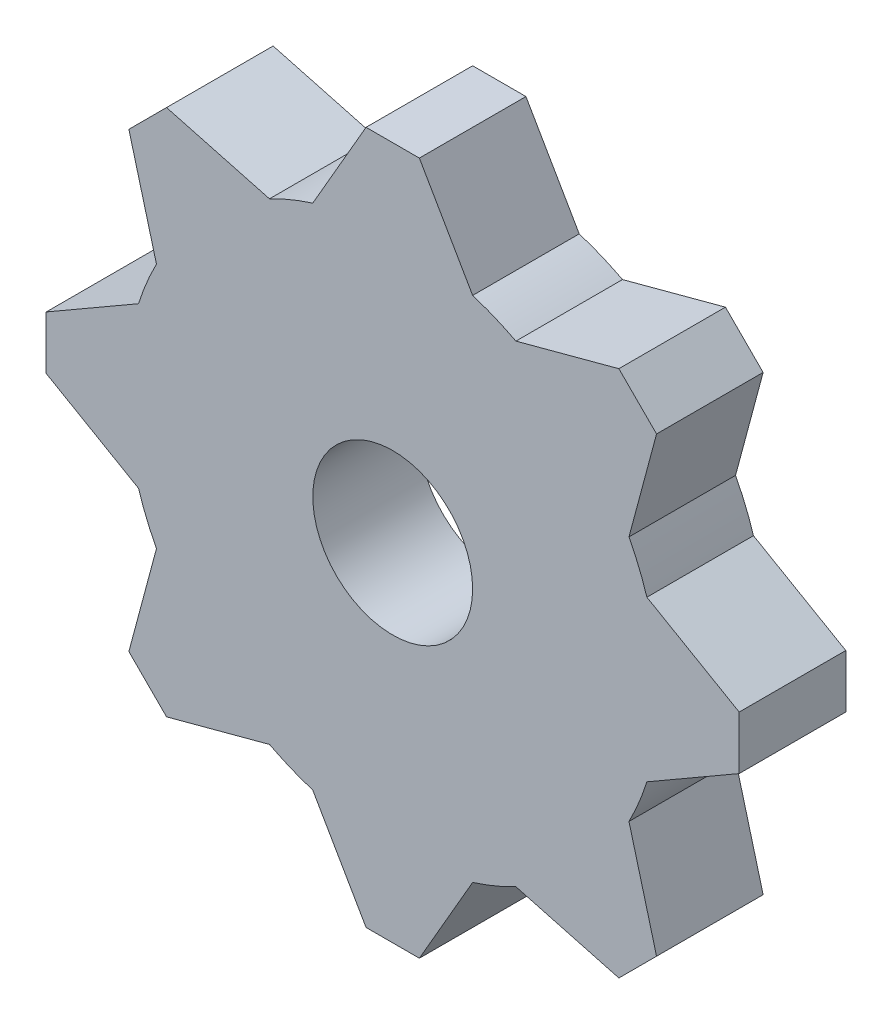
ISO-10303-21;
HEADER;
FILE_DESCRIPTION(('STEP AP214'),'2;1');
FILE_NAME('part.step','',(''),(''),'','','');
FILE_SCHEMA(('AUTOMOTIVE_DESIGN { 1 0 10303 214 1 1 1 1 }'));
ENDSEC;
DATA;
#1=APPLICATION_CONTEXT('core data for automotive mechanical design processes');
#2=APPLICATION_PROTOCOL_DEFINITION('international standard','automotive_design',2000,#1);
#3=PRODUCT_CONTEXT('',#1,'mechanical');
#4=PRODUCT('Part','Part','',(#3));
#5=PRODUCT_RELATED_PRODUCT_CATEGORY('part','',(#4));
#6=PRODUCT_DEFINITION_FORMATION('','',#4);
#7=PRODUCT_DEFINITION_CONTEXT('part definition',#1,'design');
#8=PRODUCT_DEFINITION('design','',#6,#7);
#9=PRODUCT_DEFINITION_SHAPE('','',#8);
#10=(LENGTH_UNIT() NAMED_UNIT(*) SI_UNIT(.MILLI.,.METRE.));
#11=(NAMED_UNIT(*) PLANE_ANGLE_UNIT() SI_UNIT($,.RADIAN.));
#12=(NAMED_UNIT(*) SI_UNIT($,.STERADIAN.) SOLID_ANGLE_UNIT());
#13=UNCERTAINTY_MEASURE_WITH_UNIT(LENGTH_MEASURE(1.E-05),#10,'distance_accuracy_value','');
#14=(GEOMETRIC_REPRESENTATION_CONTEXT(3) GLOBAL_UNCERTAINTY_ASSIGNED_CONTEXT((#13)) GLOBAL_UNIT_ASSIGNED_CONTEXT((#10,
#11,#12)) REPRESENTATION_CONTEXT('',''));
#15=CARTESIAN_POINT('',(0.,0.,0.));
#16=DIRECTION('',(0.,0.,1.));
#17=DIRECTION('',(1.,0.,0.));
#18=AXIS2_PLACEMENT_3D('',#15,#16,#17);
#19=CARTESIAN_POINT('',(0.,0.,20.));
#20=DIRECTION('',(0.,0.,1.));
#21=DIRECTION('',(1.,0.,0.));
#22=AXIS2_PLACEMENT_3D('',#19,#20,#21);
#23=PLANE('',#22);
#24=DIRECTION('',(-0.500000000000001,-0.866025403784438,0.));
#25=VECTOR('',#24,1.);
#26=CARTESIAN_POINT('',(-5.00000000000001,65.0174681465361,20.));
#27=LINE('',#26,#25);
#28=CARTESIAN_POINT('',(-5.00000000000001,65.0174681465361,20.));
#29=VERTEX_POINT('',#28);
#30=CARTESIAN_POINT('',(-15.,47.6969600708473,20.));
#31=VERTEX_POINT('',#30);
#32=EDGE_CURVE('E380',#29,#31,#27,.T.);
#33=ORIENTED_EDGE('',*,*,#32,.T.);
#34=CARTESIAN_POINT('',(0.,0.,20.));
#35=DIRECTION('',(0.,0.,1.));
#36=DIRECTION('',(1.,0.,0.));
#37=AXIS2_PLACEMENT_3D('',#34,#35,#36);
#38=CIRCLE('',#37,50.);
#39=CARTESIAN_POINT('',(-23.1202421902819,44.3334456258783,20.));
#40=VERTEX_POINT('',#39);
#41=EDGE_CURVE('E172',#31,#40,#38,.T.);
#42=ORIENTED_EDGE('',*,*,#41,.T.);
#43=DIRECTION('',(-0.965925826289068,0.25881904510252,0.));
#44=VECTOR('',#43,1.);
#45=CARTESIAN_POINT('',(-42.4387587160633,49.5098265279287,20.));
#46=LINE('',#45,#44);
#47=CARTESIAN_POINT('',(-42.4387587160633,49.5098265279287,20.));
#48=VERTEX_POINT('',#47);
#49=EDGE_CURVE('E497',#40,#48,#46,.T.);
#50=ORIENTED_EDGE('',*,*,#49,.T.);
#51=DIRECTION('',(-0.707106781186547,-0.707106781186548,0.));
#52=VECTOR('',#51,1.);
#53=CARTESIAN_POINT('',(-49.5098265279287,42.4387587160632,20.));
#54=LINE('',#53,#52);
#55=CARTESIAN_POINT('',(-49.5098265279287,42.4387587160632,20.));
#56=VERTEX_POINT('',#55);
#57=EDGE_CURVE('E517',#48,#56,#54,.T.);
#58=ORIENTED_EDGE('',*,*,#57,.T.);
#59=DIRECTION('',(0.25881904510252,-0.965925826289069,0.));
#60=VECTOR('',#59,1.);
#61=CARTESIAN_POINT('',(-49.5098265279287,42.4387587160632,20.));
#62=LINE('',#61,#60);
#63=CARTESIAN_POINT('',(-44.3334456258783,23.1202421902819,20.));
#64=VERTEX_POINT('',#63);
#65=EDGE_CURVE('E513',#56,#64,#62,.T.);
#66=ORIENTED_EDGE('',*,*,#65,.T.);
#67=CARTESIAN_POINT('',(0.,0.,20.));
#68=DIRECTION('',(0.,0.,1.));
#69=DIRECTION('',(1.,0.,0.));
#70=AXIS2_PLACEMENT_3D('',#67,#68,#69);
#71=CIRCLE('',#70,50.);
#72=CARTESIAN_POINT('',(-47.6969600708473,15.,20.));
#73=VERTEX_POINT('',#72);
#74=EDGE_CURVE('E516',#64,#73,#71,.T.);
#75=ORIENTED_EDGE('',*,*,#74,.T.);
#76=DIRECTION('',(-0.866025403784438,-0.500000000000001,0.));
#77=VECTOR('',#76,1.);
#78=CARTESIAN_POINT('',(-65.0174681465361,4.99999999999998,20.));
#79=LINE('',#78,#77);
#80=CARTESIAN_POINT('',(-65.0174681465361,4.99999999999998,20.));
#81=VERTEX_POINT('',#80);
#82=EDGE_CURVE('E521',#73,#81,#79,.T.);
#83=ORIENTED_EDGE('',*,*,#82,.T.);
#84=DIRECTION('',(0.,-1.,0.));
#85=VECTOR('',#84,1.);
#86=CARTESIAN_POINT('',(-65.0174681465361,-5.00000000000002,20.));
#87=LINE('',#86,#85);
#88=CARTESIAN_POINT('',(-65.0174681465361,-5.00000000000002,20.));
#89=VERTEX_POINT('',#88);
#90=EDGE_CURVE('E528',#81,#89,#87,.T.);
#91=ORIENTED_EDGE('',*,*,#90,.T.);
#92=DIRECTION('',(0.866025403784438,-0.500000000000001,0.));
#93=VECTOR('',#92,1.);
#94=CARTESIAN_POINT('',(-65.0174681465361,-5.00000000000002,20.));
#95=LINE('',#94,#93);
#96=CARTESIAN_POINT('',(-47.6969600708473,-15.,20.));
#97=VERTEX_POINT('',#96);
#98=EDGE_CURVE('E531',#89,#97,#95,.T.);
#99=ORIENTED_EDGE('',*,*,#98,.T.);
#100=CARTESIAN_POINT('',(0.,0.,20.));
#101=DIRECTION('',(0.,0.,1.));
#102=DIRECTION('',(1.,0.,0.));
#103=AXIS2_PLACEMENT_3D('',#100,#101,#102);
#104=CIRCLE('',#103,50.);
#105=CARTESIAN_POINT('',(-44.3334456258783,-23.1202421902819,20.));
#106=VERTEX_POINT('',#105);
#107=EDGE_CURVE('E534',#97,#106,#104,.T.);
#108=ORIENTED_EDGE('',*,*,#107,.T.);
#109=DIRECTION('',(-0.25881904510252,-0.965925826289068,0.));
#110=VECTOR('',#109,1.);
#111=CARTESIAN_POINT('',(-49.5098265279287,-42.4387587160633,20.));
#112=LINE('',#111,#110);
#113=CARTESIAN_POINT('',(-49.5098265279287,-42.4387587160633,20.));
#114=VERTEX_POINT('',#113);
#115=EDGE_CURVE('E537',#106,#114,#112,.T.);
#116=ORIENTED_EDGE('',*,*,#115,.T.);
#117=DIRECTION('',(0.707106781186548,-0.707106781186547,0.));
#118=VECTOR('',#117,1.);
#119=CARTESIAN_POINT('',(-42.4387587160632,-49.5098265279287,20.));
#120=LINE('',#119,#118);
#121=CARTESIAN_POINT('',(-42.4387587160632,-49.5098265279287,20.));
#122=VERTEX_POINT('',#121);
#123=EDGE_CURVE('E540',#114,#122,#120,.T.);
#124=ORIENTED_EDGE('',*,*,#123,.T.);
#125=DIRECTION('',(0.965925826289069,0.25881904510252,0.));
#126=VECTOR('',#125,1.);
#127=CARTESIAN_POINT('',(-42.4387587160632,-49.5098265279287,20.));
#128=LINE('',#127,#126);
#129=CARTESIAN_POINT('',(-23.1202421902819,-44.3334456258783,20.));
#130=VERTEX_POINT('',#129);
#131=EDGE_CURVE('E543',#122,#130,#128,.T.);
#132=ORIENTED_EDGE('',*,*,#131,.T.);
#133=CARTESIAN_POINT('',(0.,0.,20.));
#134=DIRECTION('',(0.,0.,1.));
#135=DIRECTION('',(1.,0.,0.));
#136=AXIS2_PLACEMENT_3D('',#133,#134,#135);
#137=CIRCLE('',#136,50.);
#138=CARTESIAN_POINT('',(-15.,-47.6969600708473,20.));
#139=VERTEX_POINT('',#138);
#140=EDGE_CURVE('E546',#130,#139,#137,.T.);
#141=ORIENTED_EDGE('',*,*,#140,.T.);
#142=DIRECTION('',(0.500000000000001,-0.866025403784438,0.));
#143=VECTOR('',#142,1.);
#144=CARTESIAN_POINT('',(-4.99999999999999,-65.0174681465361,20.));
#145=LINE('',#144,#143);
#146=CARTESIAN_POINT('',(-4.99999999999999,-65.0174681465361,20.));
#147=VERTEX_POINT('',#146);
#148=EDGE_CURVE('E549',#139,#147,#145,.T.);
#149=ORIENTED_EDGE('',*,*,#148,.T.);
#150=DIRECTION('',(1.,0.,0.));
#151=VECTOR('',#150,1.);
#152=CARTESIAN_POINT('',(5.00000000000001,-65.0174681465361,20.));
#153=LINE('',#152,#151);
#154=CARTESIAN_POINT('',(5.00000000000001,-65.0174681465361,20.));
#155=VERTEX_POINT('',#154);
#156=EDGE_CURVE('E552',#147,#155,#153,.T.);
#157=ORIENTED_EDGE('',*,*,#156,.T.);
#158=DIRECTION('',(0.500000000000001,0.866025403784438,0.));
#159=VECTOR('',#158,1.);
#160=CARTESIAN_POINT('',(5.00000000000001,-65.0174681465361,20.));
#161=LINE('',#160,#159);
#162=CARTESIAN_POINT('',(15.,-47.6969600708473,20.));
#163=VERTEX_POINT('',#162);
#164=EDGE_CURVE('E555',#155,#163,#161,.T.);
#165=ORIENTED_EDGE('',*,*,#164,.T.);
#166=CARTESIAN_POINT('',(0.,0.,20.));
#167=DIRECTION('',(0.,0.,1.));
#168=DIRECTION('',(1.,0.,0.));
#169=AXIS2_PLACEMENT_3D('',#166,#167,#168);
#170=CIRCLE('',#169,50.);
#171=CARTESIAN_POINT('',(23.1202421902819,-44.3334456258783,20.));
#172=VERTEX_POINT('',#171);
#173=EDGE_CURVE('E558',#163,#172,#170,.T.);
#174=ORIENTED_EDGE('',*,*,#173,.T.);
#175=DIRECTION('',(0.965925826289068,-0.25881904510252,0.));
#176=VECTOR('',#175,1.);
#177=CARTESIAN_POINT('',(42.4387587160633,-49.5098265279287,20.));
#178=LINE('',#177,#176);
#179=CARTESIAN_POINT('',(42.4387587160633,-49.5098265279287,20.));
#180=VERTEX_POINT('',#179);
#181=EDGE_CURVE('E561',#172,#180,#178,.T.);
#182=ORIENTED_EDGE('',*,*,#181,.T.);
#183=DIRECTION('',(0.707106781186547,0.707106781186547,0.));
#184=VECTOR('',#183,1.);
#185=CARTESIAN_POINT('',(49.5098265279287,-42.4387587160632,20.));
#186=LINE('',#185,#184);
#187=CARTESIAN_POINT('',(49.5098265279287,-42.4387587160632,20.));
#188=VERTEX_POINT('',#187);
#189=EDGE_CURVE('E564',#180,#188,#186,.T.);
#190=ORIENTED_EDGE('',*,*,#189,.T.);
#191=DIRECTION('',(-0.258819045102519,0.965925826289069,0.));
#192=VECTOR('',#191,1.);
#193=CARTESIAN_POINT('',(49.5098265279287,-42.4387587160632,20.));
#194=LINE('',#193,#192);
#195=CARTESIAN_POINT('',(44.3334456258783,-23.1202421902819,20.));
#196=VERTEX_POINT('',#195);
#197=EDGE_CURVE('E567',#188,#196,#194,.T.);
#198=ORIENTED_EDGE('',*,*,#197,.T.);
#199=CARTESIAN_POINT('',(0.,0.,20.));
#200=DIRECTION('',(0.,0.,1.));
#201=DIRECTION('',(1.,0.,0.));
#202=AXIS2_PLACEMENT_3D('',#199,#200,#201);
#203=CIRCLE('',#202,50.);
#204=CARTESIAN_POINT('',(47.6969600708473,-15.,20.));
#205=VERTEX_POINT('',#204);
#206=EDGE_CURVE('E570',#196,#205,#203,.T.);
#207=ORIENTED_EDGE('',*,*,#206,.T.);
#208=DIRECTION('',(0.866025403784438,0.500000000000001,0.));
#209=VECTOR('',#208,1.);
#210=CARTESIAN_POINT('',(65.0174681465361,-4.99999999999999,20.));
#211=LINE('',#210,#209);
#212=CARTESIAN_POINT('',(65.0174681465361,-4.99999999999999,20.));
#213=VERTEX_POINT('',#212);
#214=EDGE_CURVE('E573',#205,#213,#211,.T.);
#215=ORIENTED_EDGE('',*,*,#214,.T.);
#216=DIRECTION('',(0.,1.,0.));
#217=VECTOR('',#216,1.);
#218=CARTESIAN_POINT('',(65.0174681465361,5.00000000000001,20.));
#219=LINE('',#218,#217);
#220=CARTESIAN_POINT('',(65.0174681465361,5.00000000000001,20.));
#221=VERTEX_POINT('',#220);
#222=EDGE_CURVE('E576',#213,#221,#219,.T.);
#223=ORIENTED_EDGE('',*,*,#222,.T.);
#224=DIRECTION('',(-0.866025403784438,0.500000000000001,0.));
#225=VECTOR('',#224,1.);
#226=CARTESIAN_POINT('',(65.0174681465361,5.00000000000001,20.));
#227=LINE('',#226,#225);
#228=CARTESIAN_POINT('',(47.6969600708473,15.,20.));
#229=VERTEX_POINT('',#228);
#230=EDGE_CURVE('E579',#221,#229,#227,.T.);
#231=ORIENTED_EDGE('',*,*,#230,.T.);
#232=CARTESIAN_POINT('',(0.,0.,20.));
#233=DIRECTION('',(0.,0.,1.));
#234=DIRECTION('',(1.,0.,0.));
#235=AXIS2_PLACEMENT_3D('',#232,#233,#234);
#236=CIRCLE('',#235,50.);
#237=CARTESIAN_POINT('',(44.3334456258783,23.1202421902819,20.));
#238=VERTEX_POINT('',#237);
#239=EDGE_CURVE('E582',#229,#238,#236,.T.);
#240=ORIENTED_EDGE('',*,*,#239,.T.);
#241=DIRECTION('',(0.25881904510252,0.965925826289068,0.));
#242=VECTOR('',#241,1.);
#243=CARTESIAN_POINT('',(49.5098265279287,42.4387587160633,20.));
#244=LINE('',#243,#242);
#245=CARTESIAN_POINT('',(49.5098265279287,42.4387587160633,20.));
#246=VERTEX_POINT('',#245);
#247=EDGE_CURVE('E585',#238,#246,#244,.T.);
#248=ORIENTED_EDGE('',*,*,#247,.T.);
#249=DIRECTION('',(-0.707106781186547,0.707106781186547,0.));
#250=VECTOR('',#249,1.);
#251=CARTESIAN_POINT('',(42.4387587160633,49.5098265279287,20.));
#252=LINE('',#251,#250);
#253=CARTESIAN_POINT('',(42.4387587160633,49.5098265279287,20.));
#254=VERTEX_POINT('',#253);
#255=EDGE_CURVE('E588',#246,#254,#252,.T.);
#256=ORIENTED_EDGE('',*,*,#255,.T.);
#257=DIRECTION('',(-0.965925826289069,-0.258819045102519,0.));
#258=VECTOR('',#257,1.);
#259=CARTESIAN_POINT('',(42.4387587160633,49.5098265279287,20.));
#260=LINE('',#259,#258);
#261=CARTESIAN_POINT('',(23.1202421902819,44.3334456258783,20.));
#262=VERTEX_POINT('',#261);
#263=EDGE_CURVE('E263',#254,#262,#260,.T.);
#264=ORIENTED_EDGE('',*,*,#263,.T.);
#265=CARTESIAN_POINT('',(0.,0.,20.));
#266=DIRECTION('',(0.,0.,1.));
#267=DIRECTION('',(1.,0.,0.));
#268=AXIS2_PLACEMENT_3D('',#265,#266,#267);
#269=CIRCLE('',#268,50.);
#270=CARTESIAN_POINT('',(15.,47.6969600708473,20.));
#271=VERTEX_POINT('',#270);
#272=EDGE_CURVE('E257',#262,#271,#269,.T.);
#273=ORIENTED_EDGE('',*,*,#272,.T.);
#274=DIRECTION('',(-0.500000000000001,0.866025403784438,0.));
#275=VECTOR('',#274,1.);
#276=CARTESIAN_POINT('',(4.99999999999999,65.0174681465361,20.));
#277=LINE('',#276,#275);
#278=CARTESIAN_POINT('',(4.99999999999999,65.0174681465361,20.));
#279=VERTEX_POINT('',#278);
#280=EDGE_CURVE('E261',#271,#279,#277,.T.);
#281=ORIENTED_EDGE('',*,*,#280,.T.);
#282=DIRECTION('',(-1.,0.,0.));
#283=VECTOR('',#282,1.);
#284=CARTESIAN_POINT('',(-5.00000000000001,65.0174681465361,20.));
#285=LINE('',#284,#283);
#286=EDGE_CURVE('E57',#279,#29,#285,.T.);
#287=ORIENTED_EDGE('',*,*,#286,.T.);
#288=EDGE_LOOP('',(#33,#42,#50,#58,#66,#75,#83,#91,#99,#108,#116,#124,#132,#141,#149,#157,#165,
#174,#182,#190,#198,#207,#215,#223,#231,#240,#248,#256,#264,#273,#281,#287));
#289=FACE_BOUND('',#288,.T.);
#290=CARTESIAN_POINT('',(0.,0.,20.));
#291=DIRECTION('',(0.,0.,1.));
#292=DIRECTION('',(1.,0.,0.));
#293=AXIS2_PLACEMENT_3D('',#290,#291,#292);
#294=CIRCLE('',#293,15.);
#295=CARTESIAN_POINT('',(15.,0.,20.));
#296=VERTEX_POINT('',#295);
#297=EDGE_CURVE('E290',#296,#296,#294,.T.);
#298=ORIENTED_EDGE('',*,*,#297,.F.);
#299=EDGE_LOOP('',(#298));
#300=FACE_BOUND('',#299,.T.);
#301=ADVANCED_FACE('F39',(#289,#300),#23,.T.);
#302=CARTESIAN_POINT('',(0.,0.,0.));
#303=DIRECTION('',(0.,0.,1.));
#304=DIRECTION('',(1.,0.,0.));
#305=AXIS2_PLACEMENT_3D('',#302,#303,#304);
#306=PLANE('',#305);
#307=DIRECTION('',(-0.500000000000001,-0.866025403784438,0.));
#308=VECTOR('',#307,1.);
#309=CARTESIAN_POINT('',(-5.00000000000001,65.0174681465361,0.));
#310=LINE('',#309,#308);
#311=CARTESIAN_POINT('',(-5.00000000000001,65.0174681465361,0.));
#312=VERTEX_POINT('',#311);
#313=CARTESIAN_POINT('',(-15.,47.6969600708473,0.));
#314=VERTEX_POINT('',#313);
#315=EDGE_CURVE('E285',#312,#314,#310,.T.);
#316=ORIENTED_EDGE('',*,*,#315,.F.);
#317=DIRECTION('',(-1.,0.,0.));
#318=VECTOR('',#317,1.);
#319=CARTESIAN_POINT('',(-5.00000000000001,65.0174681465361,0.));
#320=LINE('',#319,#318);
#321=CARTESIAN_POINT('',(4.99999999999999,65.0174681465361,0.));
#322=VERTEX_POINT('',#321);
#323=EDGE_CURVE('E164',#322,#312,#320,.T.);
#324=ORIENTED_EDGE('',*,*,#323,.F.);
#325=DIRECTION('',(-0.500000000000001,0.866025403784438,0.));
#326=VECTOR('',#325,1.);
#327=CARTESIAN_POINT('',(4.99999999999999,65.0174681465361,0.));
#328=LINE('',#327,#326);
#329=CARTESIAN_POINT('',(15.,47.6969600708473,0.));
#330=VERTEX_POINT('',#329);
#331=EDGE_CURVE('E158',#330,#322,#328,.T.);
#332=ORIENTED_EDGE('',*,*,#331,.F.);
#333=CARTESIAN_POINT('',(0.,0.,0.));
#334=DIRECTION('',(0.,0.,1.));
#335=DIRECTION('',(1.,0.,0.));
#336=AXIS2_PLACEMENT_3D('',#333,#334,#335);
#337=CIRCLE('',#336,50.);
#338=CARTESIAN_POINT('',(23.1202421902819,44.3334456258783,0.));
#339=VERTEX_POINT('',#338);
#340=EDGE_CURVE('E272',#339,#330,#337,.T.);
#341=ORIENTED_EDGE('',*,*,#340,.F.);
#342=DIRECTION('',(-0.965925826289069,-0.258819045102519,0.));
#343=VECTOR('',#342,1.);
#344=CARTESIAN_POINT('',(42.4387587160633,49.5098265279287,0.));
#345=LINE('',#344,#343);
#346=CARTESIAN_POINT('',(42.4387587160633,49.5098265279287,0.));
#347=VERTEX_POINT('',#346);
#348=EDGE_CURVE('E371',#347,#339,#345,.T.);
#349=ORIENTED_EDGE('',*,*,#348,.F.);
#350=DIRECTION('',(-0.707106781186547,0.707106781186547,0.));
#351=VECTOR('',#350,1.);
#352=CARTESIAN_POINT('',(42.4387587160633,49.5098265279287,0.));
#353=LINE('',#352,#351);
#354=CARTESIAN_POINT('',(49.5098265279287,42.4387587160633,0.));
#355=VERTEX_POINT('',#354);
#356=EDGE_CURVE('E368',#355,#347,#353,.T.);
#357=ORIENTED_EDGE('',*,*,#356,.F.);
#358=DIRECTION('',(0.25881904510252,0.965925826289068,0.));
#359=VECTOR('',#358,1.);
#360=CARTESIAN_POINT('',(49.5098265279287,42.4387587160633,0.));
#361=LINE('',#360,#359);
#362=CARTESIAN_POINT('',(44.3334456258783,23.1202421902819,0.));
#363=VERTEX_POINT('',#362);
#364=EDGE_CURVE('E365',#363,#355,#361,.T.);
#365=ORIENTED_EDGE('',*,*,#364,.F.);
#366=CARTESIAN_POINT('',(0.,0.,0.));
#367=DIRECTION('',(0.,0.,1.));
#368=DIRECTION('',(1.,0.,0.));
#369=AXIS2_PLACEMENT_3D('',#366,#367,#368);
#370=CIRCLE('',#369,50.);
#371=CARTESIAN_POINT('',(47.6969600708473,15.,0.));
#372=VERTEX_POINT('',#371);
#373=EDGE_CURVE('E362',#372,#363,#370,.T.);
#374=ORIENTED_EDGE('',*,*,#373,.F.);
#375=DIRECTION('',(-0.866025403784438,0.500000000000001,0.));
#376=VECTOR('',#375,1.);
#377=CARTESIAN_POINT('',(65.0174681465361,5.00000000000001,0.));
#378=LINE('',#377,#376);
#379=CARTESIAN_POINT('',(65.0174681465361,5.00000000000001,0.));
#380=VERTEX_POINT('',#379);
#381=EDGE_CURVE('E359',#380,#372,#378,.T.);
#382=ORIENTED_EDGE('',*,*,#381,.F.);
#383=DIRECTION('',(0.,1.,0.));
#384=VECTOR('',#383,1.);
#385=CARTESIAN_POINT('',(65.0174681465361,5.00000000000001,0.));
#386=LINE('',#385,#384);
#387=CARTESIAN_POINT('',(65.0174681465361,-4.99999999999999,0.));
#388=VERTEX_POINT('',#387);
#389=EDGE_CURVE('E356',#388,#380,#386,.T.);
#390=ORIENTED_EDGE('',*,*,#389,.F.);
#391=DIRECTION('',(0.866025403784438,0.500000000000001,0.));
#392=VECTOR('',#391,1.);
#393=CARTESIAN_POINT('',(65.0174681465361,-4.99999999999999,0.));
#394=LINE('',#393,#392);
#395=CARTESIAN_POINT('',(47.6969600708473,-15.,0.));
#396=VERTEX_POINT('',#395);
#397=EDGE_CURVE('E353',#396,#388,#394,.T.);
#398=ORIENTED_EDGE('',*,*,#397,.F.);
#399=CARTESIAN_POINT('',(0.,0.,0.));
#400=DIRECTION('',(0.,0.,1.));
#401=DIRECTION('',(1.,0.,0.));
#402=AXIS2_PLACEMENT_3D('',#399,#400,#401);
#403=CIRCLE('',#402,50.);
#404=CARTESIAN_POINT('',(44.3334456258783,-23.1202421902819,0.));
#405=VERTEX_POINT('',#404);
#406=EDGE_CURVE('E350',#405,#396,#403,.T.);
#407=ORIENTED_EDGE('',*,*,#406,.F.);
#408=DIRECTION('',(-0.258819045102519,0.965925826289069,0.));
#409=VECTOR('',#408,1.);
#410=CARTESIAN_POINT('',(49.5098265279287,-42.4387587160632,0.));
#411=LINE('',#410,#409);
#412=CARTESIAN_POINT('',(49.5098265279287,-42.4387587160632,0.));
#413=VERTEX_POINT('',#412);
#414=EDGE_CURVE('E347',#413,#405,#411,.T.);
#415=ORIENTED_EDGE('',*,*,#414,.F.);
#416=DIRECTION('',(0.707106781186547,0.707106781186547,0.));
#417=VECTOR('',#416,1.);
#418=CARTESIAN_POINT('',(49.5098265279287,-42.4387587160632,0.));
#419=LINE('',#418,#417);
#420=CARTESIAN_POINT('',(42.4387587160633,-49.5098265279287,0.));
#421=VERTEX_POINT('',#420);
#422=EDGE_CURVE('E344',#421,#413,#419,.T.);
#423=ORIENTED_EDGE('',*,*,#422,.F.);
#424=DIRECTION('',(0.965925826289068,-0.25881904510252,0.));
#425=VECTOR('',#424,1.);
#426=CARTESIAN_POINT('',(42.4387587160633,-49.5098265279287,0.));
#427=LINE('',#426,#425);
#428=CARTESIAN_POINT('',(23.1202421902819,-44.3334456258783,0.));
#429=VERTEX_POINT('',#428);
#430=EDGE_CURVE('E341',#429,#421,#427,.T.);
#431=ORIENTED_EDGE('',*,*,#430,.F.);
#432=CARTESIAN_POINT('',(0.,0.,0.));
#433=DIRECTION('',(0.,0.,1.));
#434=DIRECTION('',(1.,0.,0.));
#435=AXIS2_PLACEMENT_3D('',#432,#433,#434);
#436=CIRCLE('',#435,50.);
#437=CARTESIAN_POINT('',(15.,-47.6969600708473,0.));
#438=VERTEX_POINT('',#437);
#439=EDGE_CURVE('E338',#438,#429,#436,.T.);
#440=ORIENTED_EDGE('',*,*,#439,.F.);
#441=DIRECTION('',(0.500000000000001,0.866025403784438,0.));
#442=VECTOR('',#441,1.);
#443=CARTESIAN_POINT('',(5.00000000000001,-65.0174681465361,0.));
#444=LINE('',#443,#442);
#445=CARTESIAN_POINT('',(5.00000000000001,-65.0174681465361,0.));
#446=VERTEX_POINT('',#445);
#447=EDGE_CURVE('E335',#446,#438,#444,.T.);
#448=ORIENTED_EDGE('',*,*,#447,.F.);
#449=DIRECTION('',(1.,0.,0.));
#450=VECTOR('',#449,1.);
#451=CARTESIAN_POINT('',(5.00000000000001,-65.0174681465361,0.));
#452=LINE('',#451,#450);
#453=CARTESIAN_POINT('',(-4.99999999999999,-65.0174681465361,0.));
#454=VERTEX_POINT('',#453);
#455=EDGE_CURVE('E332',#454,#446,#452,.T.);
#456=ORIENTED_EDGE('',*,*,#455,.F.);
#457=DIRECTION('',(0.500000000000001,-0.866025403784438,0.));
#458=VECTOR('',#457,1.);
#459=CARTESIAN_POINT('',(-4.99999999999999,-65.0174681465361,0.));
#460=LINE('',#459,#458);
#461=CARTESIAN_POINT('',(-15.,-47.6969600708473,0.));
#462=VERTEX_POINT('',#461);
#463=EDGE_CURVE('E329',#462,#454,#460,.T.);
#464=ORIENTED_EDGE('',*,*,#463,.F.);
#465=CARTESIAN_POINT('',(0.,0.,0.));
#466=DIRECTION('',(0.,0.,1.));
#467=DIRECTION('',(1.,0.,0.));
#468=AXIS2_PLACEMENT_3D('',#465,#466,#467);
#469=CIRCLE('',#468,50.);
#470=CARTESIAN_POINT('',(-23.1202421902819,-44.3334456258783,0.));
#471=VERTEX_POINT('',#470);
#472=EDGE_CURVE('E326',#471,#462,#469,.T.);
#473=ORIENTED_EDGE('',*,*,#472,.F.);
#474=DIRECTION('',(0.965925826289069,0.25881904510252,0.));
#475=VECTOR('',#474,1.);
#476=CARTESIAN_POINT('',(-42.4387587160632,-49.5098265279287,0.));
#477=LINE('',#476,#475);
#478=CARTESIAN_POINT('',(-42.4387587160632,-49.5098265279287,0.));
#479=VERTEX_POINT('',#478);
#480=EDGE_CURVE('E323',#479,#471,#477,.T.);
#481=ORIENTED_EDGE('',*,*,#480,.F.);
#482=DIRECTION('',(0.707106781186548,-0.707106781186547,0.));
#483=VECTOR('',#482,1.);
#484=CARTESIAN_POINT('',(-42.4387587160632,-49.5098265279287,0.));
#485=LINE('',#484,#483);
#486=CARTESIAN_POINT('',(-49.5098265279287,-42.4387587160633,0.));
#487=VERTEX_POINT('',#486);
#488=EDGE_CURVE('E320',#487,#479,#485,.T.);
#489=ORIENTED_EDGE('',*,*,#488,.F.);
#490=DIRECTION('',(-0.25881904510252,-0.965925826289068,0.));
#491=VECTOR('',#490,1.);
#492=CARTESIAN_POINT('',(-49.5098265279287,-42.4387587160633,0.));
#493=LINE('',#492,#491);
#494=CARTESIAN_POINT('',(-44.3334456258783,-23.1202421902819,0.));
#495=VERTEX_POINT('',#494);
#496=EDGE_CURVE('E317',#495,#487,#493,.T.);
#497=ORIENTED_EDGE('',*,*,#496,.F.);
#498=CARTESIAN_POINT('',(0.,0.,0.));
#499=DIRECTION('',(0.,0.,1.));
#500=DIRECTION('',(1.,0.,0.));
#501=AXIS2_PLACEMENT_3D('',#498,#499,#500);
#502=CIRCLE('',#501,50.);
#503=CARTESIAN_POINT('',(-47.6969600708473,-15.,0.));
#504=VERTEX_POINT('',#503);
#505=EDGE_CURVE('E314',#504,#495,#502,.T.);
#506=ORIENTED_EDGE('',*,*,#505,.F.);
#507=DIRECTION('',(0.866025403784438,-0.500000000000001,0.));
#508=VECTOR('',#507,1.);
#509=CARTESIAN_POINT('',(-65.0174681465361,-5.00000000000002,0.));
#510=LINE('',#509,#508);
#511=CARTESIAN_POINT('',(-65.0174681465361,-5.00000000000002,0.));
#512=VERTEX_POINT('',#511);
#513=EDGE_CURVE('E311',#512,#504,#510,.T.);
#514=ORIENTED_EDGE('',*,*,#513,.F.);
#515=DIRECTION('',(0.,-1.,0.));
#516=VECTOR('',#515,1.);
#517=CARTESIAN_POINT('',(-65.0174681465361,-5.00000000000002,0.));
#518=LINE('',#517,#516);
#519=CARTESIAN_POINT('',(-65.0174681465361,4.99999999999998,0.));
#520=VERTEX_POINT('',#519);
#521=EDGE_CURVE('E308',#520,#512,#518,.T.);
#522=ORIENTED_EDGE('',*,*,#521,.F.);
#523=DIRECTION('',(-0.866025403784438,-0.500000000000001,0.));
#524=VECTOR('',#523,1.);
#525=CARTESIAN_POINT('',(-65.0174681465361,4.99999999999998,0.));
#526=LINE('',#525,#524);
#527=CARTESIAN_POINT('',(-47.6969600708473,15.,0.));
#528=VERTEX_POINT('',#527);
#529=EDGE_CURVE('E305',#528,#520,#526,.T.);
#530=ORIENTED_EDGE('',*,*,#529,.F.);
#531=CARTESIAN_POINT('',(0.,0.,0.));
#532=DIRECTION('',(0.,0.,1.));
#533=DIRECTION('',(1.,0.,0.));
#534=AXIS2_PLACEMENT_3D('',#531,#532,#533);
#535=CIRCLE('',#534,50.);
#536=CARTESIAN_POINT('',(-44.3334456258783,23.1202421902819,0.));
#537=VERTEX_POINT('',#536);
#538=EDGE_CURVE('E302',#537,#528,#535,.T.);
#539=ORIENTED_EDGE('',*,*,#538,.F.);
#540=DIRECTION('',(0.25881904510252,-0.965925826289069,0.));
#541=VECTOR('',#540,1.);
#542=CARTESIAN_POINT('',(-49.5098265279287,42.4387587160632,0.));
#543=LINE('',#542,#541);
#544=CARTESIAN_POINT('',(-49.5098265279287,42.4387587160632,0.));
#545=VERTEX_POINT('',#544);
#546=EDGE_CURVE('E299',#545,#537,#543,.T.);
#547=ORIENTED_EDGE('',*,*,#546,.F.);
#548=DIRECTION('',(-0.707106781186547,-0.707106781186548,0.));
#549=VECTOR('',#548,1.);
#550=CARTESIAN_POINT('',(-49.5098265279287,42.4387587160632,0.));
#551=LINE('',#550,#549);
#552=CARTESIAN_POINT('',(-42.4387587160633,49.5098265279287,0.));
#553=VERTEX_POINT('',#552);
#554=EDGE_CURVE('E296',#553,#545,#551,.T.);
#555=ORIENTED_EDGE('',*,*,#554,.F.);
#556=DIRECTION('',(-0.965925826289068,0.25881904510252,0.));
#557=VECTOR('',#556,1.);
#558=CARTESIAN_POINT('',(-42.4387587160633,49.5098265279287,0.));
#559=LINE('',#558,#557);
#560=CARTESIAN_POINT('',(-23.1202421902819,44.3334456258783,0.));
#561=VERTEX_POINT('',#560);
#562=EDGE_CURVE('E293',#561,#553,#559,.T.);
#563=ORIENTED_EDGE('',*,*,#562,.F.);
#564=CARTESIAN_POINT('',(0.,0.,0.));
#565=DIRECTION('',(0.,0.,1.));
#566=DIRECTION('',(1.,0.,0.));
#567=AXIS2_PLACEMENT_3D('',#564,#565,#566);
#568=CIRCLE('',#567,50.);
#569=EDGE_CURVE('E289',#314,#561,#568,.T.);
#570=ORIENTED_EDGE('',*,*,#569,.F.);
#571=EDGE_LOOP('',(#316,#324,#332,#341,#349,#357,#365,#374,#382,#390,#398,#407,#415,#423,#431,
#440,#448,#456,#464,#473,#481,#489,#497,#506,#514,#522,#530,#539,#547,#555,#563,#570));
#572=FACE_BOUND('',#571,.T.);
#573=CARTESIAN_POINT('',(0.,0.,0.));
#574=DIRECTION('',(0.,0.,1.));
#575=DIRECTION('',(1.,0.,0.));
#576=AXIS2_PLACEMENT_3D('',#573,#574,#575);
#577=CIRCLE('',#576,15.);
#578=CARTESIAN_POINT('',(15.,0.,0.));
#579=VERTEX_POINT('',#578);
#580=EDGE_CURVE('E997',#579,#579,#577,.T.);
#581=ORIENTED_EDGE('',*,*,#580,.T.);
#582=EDGE_LOOP('',(#581));
#583=FACE_BOUND('',#582,.T.);
#584=ADVANCED_FACE('F501',(#572,#583),#306,.F.);
#585=CARTESIAN_POINT('',(-5.00000000000001,65.0174681465361,20.));
#586=DIRECTION('',(0.866025403784438,-0.500000000000001,0.));
#587=DIRECTION('',(0.500000000000001,0.866025403784438,0.));
#588=AXIS2_PLACEMENT_3D('',#585,#586,#587);
#589=PLANE('',#588);
#590=ORIENTED_EDGE('',*,*,#315,.T.);
#591=DIRECTION('',(0.,0.,-1.));
#592=VECTOR('',#591,1.);
#593=CARTESIAN_POINT('',(-15.,47.6969600708473,20.));
#594=LINE('',#593,#592);
#595=EDGE_CURVE('E11',#31,#314,#594,.T.);
#596=ORIENTED_EDGE('',*,*,#595,.F.);
#597=ORIENTED_EDGE('',*,*,#32,.F.);
#598=DIRECTION('',(0.,0.,-1.));
#599=VECTOR('',#598,1.);
#600=CARTESIAN_POINT('',(-5.00000000000001,65.0174681465361,20.));
#601=LINE('',#600,#599);
#602=EDGE_CURVE('E281',#29,#312,#601,.T.);
#603=ORIENTED_EDGE('',*,*,#602,.T.);
#604=EDGE_LOOP('',(#590,#596,#597,#603));
#605=FACE_BOUND('',#604,.T.);
#606=ADVANCED_FACE('F41',(#605),#589,.F.);
#607=CARTESIAN_POINT('',(0.,0.,20.));
#608=DIRECTION('',(0.,0.,-1.));
#609=DIRECTION('',(-1.,0.,0.));
#610=AXIS2_PLACEMENT_3D('',#607,#608,#609);
#611=CYLINDRICAL_SURFACE('',#610,50.);
#612=ORIENTED_EDGE('',*,*,#569,.T.);
#613=DIRECTION('',(0.,0.,-1.));
#614=VECTOR('',#613,1.);
#615=CARTESIAN_POINT('',(-23.1202421902819,44.3334456258783,20.));
#616=LINE('',#615,#614);
#617=EDGE_CURVE('E49',#40,#561,#616,.T.);
#618=ORIENTED_EDGE('',*,*,#617,.F.);
#619=ORIENTED_EDGE('',*,*,#41,.F.);
#620=ORIENTED_EDGE('',*,*,#595,.T.);
#621=EDGE_LOOP('',(#612,#618,#619,#620));
#622=FACE_BOUND('',#621,.T.);
#623=ADVANCED_FACE('F624',(#622),#611,.T.);
#624=CARTESIAN_POINT('',(-42.4387587160633,49.5098265279287,20.));
#625=DIRECTION('',(-0.25881904510252,-0.965925826289069,0.));
#626=DIRECTION('',(0.965925826289069,-0.25881904510252,0.));
#627=AXIS2_PLACEMENT_3D('',#624,#625,#626);
#628=PLANE('',#627);
#629=ORIENTED_EDGE('',*,*,#562,.T.);
#630=DIRECTION('',(0.,0.,-1.));
#631=VECTOR('',#630,1.);
#632=CARTESIAN_POINT('',(-42.4387587160633,49.5098265279287,20.));
#633=LINE('',#632,#631);
#634=EDGE_CURVE('E487',#48,#553,#633,.T.);
#635=ORIENTED_EDGE('',*,*,#634,.F.);
#636=ORIENTED_EDGE('',*,*,#49,.F.);
#637=ORIENTED_EDGE('',*,*,#617,.T.);
#638=EDGE_LOOP('',(#629,#635,#636,#637));
#639=FACE_BOUND('',#638,.T.);
#640=ADVANCED_FACE('F495',(#639),#628,.F.);
#641=CARTESIAN_POINT('',(-49.5098265279287,42.4387587160632,20.));
#642=DIRECTION('',(0.707106781186548,-0.707106781186547,0.));
#643=DIRECTION('',(0.707106781186547,0.707106781186548,0.));
#644=AXIS2_PLACEMENT_3D('',#641,#642,#643);
#645=PLANE('',#644);
#646=ORIENTED_EDGE('',*,*,#554,.T.);
#647=DIRECTION('',(0.,0.,-1.));
#648=VECTOR('',#647,1.);
#649=CARTESIAN_POINT('',(-49.5098265279287,42.4387587160632,20.));
#650=LINE('',#649,#648);
#651=EDGE_CURVE('E483',#56,#545,#650,.T.);
#652=ORIENTED_EDGE('',*,*,#651,.F.);
#653=ORIENTED_EDGE('',*,*,#57,.F.);
#654=ORIENTED_EDGE('',*,*,#634,.T.);
#655=EDGE_LOOP('',(#646,#652,#653,#654));
#656=FACE_BOUND('',#655,.T.);
#657=ADVANCED_FACE('F507',(#656),#645,.F.);
#658=CARTESIAN_POINT('',(-49.5098265279287,42.4387587160632,20.));
#659=DIRECTION('',(0.965925826289069,0.25881904510252,0.));
#660=DIRECTION('',(-0.25881904510252,0.965925826289069,0.));
#661=AXIS2_PLACEMENT_3D('',#658,#659,#660);
#662=PLANE('',#661);
#663=ORIENTED_EDGE('',*,*,#546,.T.);
#664=DIRECTION('',(0.,0.,-1.));
#665=VECTOR('',#664,1.);
#666=CARTESIAN_POINT('',(-44.3334456258783,23.1202421902819,20.));
#667=LINE('',#666,#665);
#668=EDGE_CURVE('E479',#64,#537,#667,.T.);
#669=ORIENTED_EDGE('',*,*,#668,.F.);
#670=ORIENTED_EDGE('',*,*,#65,.F.);
#671=ORIENTED_EDGE('',*,*,#651,.T.);
#672=EDGE_LOOP('',(#663,#669,#670,#671));
#673=FACE_BOUND('',#672,.T.);
#674=ADVANCED_FACE('F511',(#673),#662,.F.);
#675=CARTESIAN_POINT('',(0.,0.,20.));
#676=DIRECTION('',(0.,0.,-1.));
#677=DIRECTION('',(-1.,0.,0.));
#678=AXIS2_PLACEMENT_3D('',#675,#676,#677);
#679=CYLINDRICAL_SURFACE('',#678,50.);
#680=ORIENTED_EDGE('',*,*,#538,.T.);
#681=DIRECTION('',(0.,0.,-1.));
#682=VECTOR('',#681,1.);
#683=CARTESIAN_POINT('',(-47.6969600708473,15.,20.));
#684=LINE('',#683,#682);
#685=EDGE_CURVE('E475',#73,#528,#684,.T.);
#686=ORIENTED_EDGE('',*,*,#685,.F.);
#687=ORIENTED_EDGE('',*,*,#74,.F.);
#688=ORIENTED_EDGE('',*,*,#668,.T.);
#689=EDGE_LOOP('',(#680,#686,#687,#688));
#690=FACE_BOUND('',#689,.T.);
#691=ADVANCED_FACE('F637',(#690),#679,.T.);
#692=CARTESIAN_POINT('',(-65.0174681465361,4.99999999999998,20.));
#693=DIRECTION('',(0.500000000000001,-0.866025403784438,0.));
#694=DIRECTION('',(0.866025403784438,0.500000000000001,0.));
#695=AXIS2_PLACEMENT_3D('',#692,#693,#694);
#696=PLANE('',#695);
#697=ORIENTED_EDGE('',*,*,#529,.T.);
#698=DIRECTION('',(0.,0.,-1.));
#699=VECTOR('',#698,1.);
#700=CARTESIAN_POINT('',(-65.0174681465361,4.99999999999998,20.));
#701=LINE('',#700,#699);
#702=EDGE_CURVE('E471',#81,#520,#701,.T.);
#703=ORIENTED_EDGE('',*,*,#702,.F.);
#704=ORIENTED_EDGE('',*,*,#82,.F.);
#705=ORIENTED_EDGE('',*,*,#685,.T.);
#706=EDGE_LOOP('',(#697,#703,#704,#705));
#707=FACE_BOUND('',#706,.T.);
#708=ADVANCED_FACE('F640',(#707),#696,.F.);
#709=CARTESIAN_POINT('',(-65.0174681465361,-5.00000000000002,20.));
#710=DIRECTION('',(1.,0.,0.));
#711=DIRECTION('',(0.,0.,-1.));
#712=AXIS2_PLACEMENT_3D('',#709,#710,#711);
#713=PLANE('',#712);
#714=ORIENTED_EDGE('',*,*,#521,.T.);
#715=DIRECTION('',(0.,0.,-1.));
#716=VECTOR('',#715,1.);
#717=CARTESIAN_POINT('',(-65.0174681465361,-5.00000000000002,20.));
#718=LINE('',#717,#716);
#719=EDGE_CURVE('E467',#89,#512,#718,.T.);
#720=ORIENTED_EDGE('',*,*,#719,.F.);
#721=ORIENTED_EDGE('',*,*,#90,.F.);
#722=ORIENTED_EDGE('',*,*,#702,.T.);
#723=EDGE_LOOP('',(#714,#720,#721,#722));
#724=FACE_BOUND('',#723,.T.);
#725=ADVANCED_FACE('F644',(#724),#713,.F.);
#726=CARTESIAN_POINT('',(-65.0174681465361,-5.00000000000002,20.));
#727=DIRECTION('',(0.500000000000001,0.866025403784438,0.));
#728=DIRECTION('',(-0.866025403784438,0.500000000000001,0.));
#729=AXIS2_PLACEMENT_3D('',#726,#727,#728);
#730=PLANE('',#729);
#731=ORIENTED_EDGE('',*,*,#513,.T.);
#732=DIRECTION('',(0.,0.,-1.));
#733=VECTOR('',#732,1.);
#734=CARTESIAN_POINT('',(-47.6969600708473,-15.,20.));
#735=LINE('',#734,#733);
#736=EDGE_CURVE('E463',#97,#504,#735,.T.);
#737=ORIENTED_EDGE('',*,*,#736,.F.);
#738=ORIENTED_EDGE('',*,*,#98,.F.);
#739=ORIENTED_EDGE('',*,*,#719,.T.);
#740=EDGE_LOOP('',(#731,#737,#738,#739));
#741=FACE_BOUND('',#740,.T.);
#742=ADVANCED_FACE('F648',(#741),#730,.F.);
#743=CARTESIAN_POINT('',(0.,0.,20.));
#744=DIRECTION('',(0.,0.,-1.));
#745=DIRECTION('',(-1.,0.,0.));
#746=AXIS2_PLACEMENT_3D('',#743,#744,#745);
#747=CYLINDRICAL_SURFACE('',#746,50.);
#748=ORIENTED_EDGE('',*,*,#505,.T.);
#749=DIRECTION('',(0.,0.,-1.));
#750=VECTOR('',#749,1.);
#751=CARTESIAN_POINT('',(-44.3334456258783,-23.1202421902819,20.));
#752=LINE('',#751,#750);
#753=EDGE_CURVE('E459',#106,#495,#752,.T.);
#754=ORIENTED_EDGE('',*,*,#753,.F.);
#755=ORIENTED_EDGE('',*,*,#107,.F.);
#756=ORIENTED_EDGE('',*,*,#736,.T.);
#757=EDGE_LOOP('',(#748,#754,#755,#756));
#758=FACE_BOUND('',#757,.T.);
#759=ADVANCED_FACE('F652',(#758),#747,.T.);
#760=CARTESIAN_POINT('',(-49.5098265279287,-42.4387587160633,20.));
#761=DIRECTION('',(0.965925826289069,-0.25881904510252,0.));
#762=DIRECTION('',(0.25881904510252,0.965925826289069,0.));
#763=AXIS2_PLACEMENT_3D('',#760,#761,#762);
#764=PLANE('',#763);
#765=ORIENTED_EDGE('',*,*,#496,.T.);
#766=DIRECTION('',(0.,0.,-1.));
#767=VECTOR('',#766,1.);
#768=CARTESIAN_POINT('',(-49.5098265279287,-42.4387587160633,20.));
#769=LINE('',#768,#767);
#770=EDGE_CURVE('E455',#114,#487,#769,.T.);
#771=ORIENTED_EDGE('',*,*,#770,.F.);
#772=ORIENTED_EDGE('',*,*,#115,.F.);
#773=ORIENTED_EDGE('',*,*,#753,.T.);
#774=EDGE_LOOP('',(#765,#771,#772,#773));
#775=FACE_BOUND('',#774,.T.);
#776=ADVANCED_FACE('F656',(#775),#764,.F.);
#777=CARTESIAN_POINT('',(-42.4387587160632,-49.5098265279287,20.));
#778=DIRECTION('',(0.707106781186547,0.707106781186548,0.));
#779=DIRECTION('',(-0.707106781186548,0.707106781186547,0.));
#780=AXIS2_PLACEMENT_3D('',#777,#778,#779);
#781=PLANE('',#780);
#782=ORIENTED_EDGE('',*,*,#488,.T.);
#783=DIRECTION('',(0.,0.,-1.));
#784=VECTOR('',#783,1.);
#785=CARTESIAN_POINT('',(-42.4387587160632,-49.5098265279287,20.));
#786=LINE('',#785,#784);
#787=EDGE_CURVE('E451',#122,#479,#786,.T.);
#788=ORIENTED_EDGE('',*,*,#787,.F.);
#789=ORIENTED_EDGE('',*,*,#123,.F.);
#790=ORIENTED_EDGE('',*,*,#770,.T.);
#791=EDGE_LOOP('',(#782,#788,#789,#790));
#792=FACE_BOUND('',#791,.T.);
#793=ADVANCED_FACE('F660',(#792),#781,.F.);
#794=CARTESIAN_POINT('',(-42.4387587160632,-49.5098265279287,20.));
#795=DIRECTION('',(-0.25881904510252,0.965925826289069,0.));
#796=DIRECTION('',(-0.965925826289069,-0.25881904510252,0.));
#797=AXIS2_PLACEMENT_3D('',#794,#795,#796);
#798=PLANE('',#797);
#799=ORIENTED_EDGE('',*,*,#480,.T.);
#800=DIRECTION('',(0.,0.,-1.));
#801=VECTOR('',#800,1.);
#802=CARTESIAN_POINT('',(-23.1202421902819,-44.3334456258783,20.));
#803=LINE('',#802,#801);
#804=EDGE_CURVE('E447',#130,#471,#803,.T.);
#805=ORIENTED_EDGE('',*,*,#804,.F.);
#806=ORIENTED_EDGE('',*,*,#131,.F.);
#807=ORIENTED_EDGE('',*,*,#787,.T.);
#808=EDGE_LOOP('',(#799,#805,#806,#807));
#809=FACE_BOUND('',#808,.T.);
#810=ADVANCED_FACE('F664',(#809),#798,.F.);
#811=CARTESIAN_POINT('',(0.,0.,20.));
#812=DIRECTION('',(0.,0.,-1.));
#813=DIRECTION('',(-1.,0.,0.));
#814=AXIS2_PLACEMENT_3D('',#811,#812,#813);
#815=CYLINDRICAL_SURFACE('',#814,50.);
#816=ORIENTED_EDGE('',*,*,#472,.T.);
#817=DIRECTION('',(0.,0.,-1.));
#818=VECTOR('',#817,1.);
#819=CARTESIAN_POINT('',(-15.,-47.6969600708473,20.));
#820=LINE('',#819,#818);
#821=EDGE_CURVE('E443',#139,#462,#820,.T.);
#822=ORIENTED_EDGE('',*,*,#821,.F.);
#823=ORIENTED_EDGE('',*,*,#140,.F.);
#824=ORIENTED_EDGE('',*,*,#804,.T.);
#825=EDGE_LOOP('',(#816,#822,#823,#824));
#826=FACE_BOUND('',#825,.T.);
#827=ADVANCED_FACE('F668',(#826),#815,.T.);
#828=CARTESIAN_POINT('',(-4.99999999999999,-65.0174681465361,20.));
#829=DIRECTION('',(0.866025403784438,0.500000000000001,0.));
#830=DIRECTION('',(-0.500000000000001,0.866025403784438,0.));
#831=AXIS2_PLACEMENT_3D('',#828,#829,#830);
#832=PLANE('',#831);
#833=ORIENTED_EDGE('',*,*,#463,.T.);
#834=DIRECTION('',(0.,0.,-1.));
#835=VECTOR('',#834,1.);
#836=CARTESIAN_POINT('',(-4.99999999999999,-65.0174681465361,20.));
#837=LINE('',#836,#835);
#838=EDGE_CURVE('E439',#147,#454,#837,.T.);
#839=ORIENTED_EDGE('',*,*,#838,.F.);
#840=ORIENTED_EDGE('',*,*,#148,.F.);
#841=ORIENTED_EDGE('',*,*,#821,.T.);
#842=EDGE_LOOP('',(#833,#839,#840,#841));
#843=FACE_BOUND('',#842,.T.);
#844=ADVANCED_FACE('F672',(#843),#832,.F.);
#845=CARTESIAN_POINT('',(5.00000000000001,-65.0174681465361,20.));
#846=DIRECTION('',(0.,1.,0.));
#847=DIRECTION('',(0.,0.,1.));
#848=AXIS2_PLACEMENT_3D('',#845,#846,#847);
#849=PLANE('',#848);
#850=ORIENTED_EDGE('',*,*,#455,.T.);
#851=DIRECTION('',(0.,0.,-1.));
#852=VECTOR('',#851,1.);
#853=CARTESIAN_POINT('',(5.00000000000001,-65.0174681465361,20.));
#854=LINE('',#853,#852);
#855=EDGE_CURVE('E435',#155,#446,#854,.T.);
#856=ORIENTED_EDGE('',*,*,#855,.F.);
#857=ORIENTED_EDGE('',*,*,#156,.F.);
#858=ORIENTED_EDGE('',*,*,#838,.T.);
#859=EDGE_LOOP('',(#850,#856,#857,#858));
#860=FACE_BOUND('',#859,.T.);
#861=ADVANCED_FACE('F676',(#860),#849,.F.);
#862=CARTESIAN_POINT('',(5.00000000000001,-65.0174681465361,20.));
#863=DIRECTION('',(-0.866025403784438,0.500000000000001,0.));
#864=DIRECTION('',(-0.500000000000001,-0.866025403784438,0.));
#865=AXIS2_PLACEMENT_3D('',#862,#863,#864);
#866=PLANE('',#865);
#867=ORIENTED_EDGE('',*,*,#447,.T.);
#868=DIRECTION('',(0.,0.,-1.));
#869=VECTOR('',#868,1.);
#870=CARTESIAN_POINT('',(15.,-47.6969600708473,20.));
#871=LINE('',#870,#869);
#872=EDGE_CURVE('E431',#163,#438,#871,.T.);
#873=ORIENTED_EDGE('',*,*,#872,.F.);
#874=ORIENTED_EDGE('',*,*,#164,.F.);
#875=ORIENTED_EDGE('',*,*,#855,.T.);
#876=EDGE_LOOP('',(#867,#873,#874,#875));
#877=FACE_BOUND('',#876,.T.);
#878=ADVANCED_FACE('F680',(#877),#866,.F.);
#879=CARTESIAN_POINT('',(0.,0.,20.));
#880=DIRECTION('',(0.,0.,-1.));
#881=DIRECTION('',(-1.,0.,0.));
#882=AXIS2_PLACEMENT_3D('',#879,#880,#881);
#883=CYLINDRICAL_SURFACE('',#882,50.);
#884=ORIENTED_EDGE('',*,*,#439,.T.);
#885=DIRECTION('',(0.,0.,-1.));
#886=VECTOR('',#885,1.);
#887=CARTESIAN_POINT('',(23.1202421902819,-44.3334456258783,20.));
#888=LINE('',#887,#886);
#889=EDGE_CURVE('E427',#172,#429,#888,.T.);
#890=ORIENTED_EDGE('',*,*,#889,.F.);
#891=ORIENTED_EDGE('',*,*,#173,.F.);
#892=ORIENTED_EDGE('',*,*,#872,.T.);
#893=EDGE_LOOP('',(#884,#890,#891,#892));
#894=FACE_BOUND('',#893,.T.);
#895=ADVANCED_FACE('F684',(#894),#883,.T.);
#896=CARTESIAN_POINT('',(42.4387587160633,-49.5098265279287,20.));
#897=DIRECTION('',(0.25881904510252,0.965925826289069,0.));
#898=DIRECTION('',(-0.965925826289069,0.25881904510252,0.));
#899=AXIS2_PLACEMENT_3D('',#896,#897,#898);
#900=PLANE('',#899);
#901=ORIENTED_EDGE('',*,*,#430,.T.);
#902=DIRECTION('',(0.,0.,-1.));
#903=VECTOR('',#902,1.);
#904=CARTESIAN_POINT('',(42.4387587160633,-49.5098265279287,20.));
#905=LINE('',#904,#903);
#906=EDGE_CURVE('E423',#180,#421,#905,.T.);
#907=ORIENTED_EDGE('',*,*,#906,.F.);
#908=ORIENTED_EDGE('',*,*,#181,.F.);
#909=ORIENTED_EDGE('',*,*,#889,.T.);
#910=EDGE_LOOP('',(#901,#907,#908,#909));
#911=FACE_BOUND('',#910,.T.);
#912=ADVANCED_FACE('F688',(#911),#900,.F.);
#913=CARTESIAN_POINT('',(49.5098265279287,-42.4387587160632,20.));
#914=DIRECTION('',(-0.707106781186548,0.707106781186548,0.));
#915=DIRECTION('',(-0.707106781186548,-0.707106781186548,0.));
#916=AXIS2_PLACEMENT_3D('',#913,#914,#915);
#917=PLANE('',#916);
#918=ORIENTED_EDGE('',*,*,#422,.T.);
#919=DIRECTION('',(0.,0.,-1.));
#920=VECTOR('',#919,1.);
#921=CARTESIAN_POINT('',(49.5098265279287,-42.4387587160632,20.));
#922=LINE('',#921,#920);
#923=EDGE_CURVE('E419',#188,#413,#922,.T.);
#924=ORIENTED_EDGE('',*,*,#923,.F.);
#925=ORIENTED_EDGE('',*,*,#189,.F.);
#926=ORIENTED_EDGE('',*,*,#906,.T.);
#927=EDGE_LOOP('',(#918,#924,#925,#926));
#928=FACE_BOUND('',#927,.T.);
#929=ADVANCED_FACE('F692',(#928),#917,.F.);
#930=CARTESIAN_POINT('',(49.5098265279287,-42.4387587160632,20.));
#931=DIRECTION('',(-0.965925826289069,-0.258819045102519,0.));
#932=DIRECTION('',(0.258819045102519,-0.965925826289069,0.));
#933=AXIS2_PLACEMENT_3D('',#930,#931,#932);
#934=PLANE('',#933);
#935=ORIENTED_EDGE('',*,*,#414,.T.);
#936=DIRECTION('',(0.,0.,-1.));
#937=VECTOR('',#936,1.);
#938=CARTESIAN_POINT('',(44.3334456258783,-23.1202421902819,20.));
#939=LINE('',#938,#937);
#940=EDGE_CURVE('E415',#196,#405,#939,.T.);
#941=ORIENTED_EDGE('',*,*,#940,.F.);
#942=ORIENTED_EDGE('',*,*,#197,.F.);
#943=ORIENTED_EDGE('',*,*,#923,.T.);
#944=EDGE_LOOP('',(#935,#941,#942,#943));
#945=FACE_BOUND('',#944,.T.);
#946=ADVANCED_FACE('F696',(#945),#934,.F.);
#947=CARTESIAN_POINT('',(0.,0.,20.));
#948=DIRECTION('',(0.,0.,-1.));
#949=DIRECTION('',(-1.,0.,0.));
#950=AXIS2_PLACEMENT_3D('',#947,#948,#949);
#951=CYLINDRICAL_SURFACE('',#950,50.);
#952=ORIENTED_EDGE('',*,*,#406,.T.);
#953=DIRECTION('',(0.,0.,-1.));
#954=VECTOR('',#953,1.);
#955=CARTESIAN_POINT('',(47.6969600708473,-15.,20.));
#956=LINE('',#955,#954);
#957=EDGE_CURVE('E411',#205,#396,#956,.T.);
#958=ORIENTED_EDGE('',*,*,#957,.F.);
#959=ORIENTED_EDGE('',*,*,#206,.F.);
#960=ORIENTED_EDGE('',*,*,#940,.T.);
#961=EDGE_LOOP('',(#952,#958,#959,#960));
#962=FACE_BOUND('',#961,.T.);
#963=ADVANCED_FACE('F700',(#962),#951,.T.);
#964=CARTESIAN_POINT('',(65.0174681465361,-4.99999999999999,20.));
#965=DIRECTION('',(-0.500000000000001,0.866025403784438,0.));
#966=DIRECTION('',(-0.866025403784438,-0.500000000000001,0.));
#967=AXIS2_PLACEMENT_3D('',#964,#965,#966);
#968=PLANE('',#967);
#969=ORIENTED_EDGE('',*,*,#397,.T.);
#970=DIRECTION('',(0.,0.,-1.));
#971=VECTOR('',#970,1.);
#972=CARTESIAN_POINT('',(65.0174681465361,-4.99999999999999,20.));
#973=LINE('',#972,#971);
#974=EDGE_CURVE('E407',#213,#388,#973,.T.);
#975=ORIENTED_EDGE('',*,*,#974,.F.);
#976=ORIENTED_EDGE('',*,*,#214,.F.);
#977=ORIENTED_EDGE('',*,*,#957,.T.);
#978=EDGE_LOOP('',(#969,#975,#976,#977));
#979=FACE_BOUND('',#978,.T.);
#980=ADVANCED_FACE('F704',(#979),#968,.F.);
#981=CARTESIAN_POINT('',(65.0174681465361,5.00000000000001,20.));
#982=DIRECTION('',(-1.,0.,0.));
#983=DIRECTION('',(0.,0.,1.));
#984=AXIS2_PLACEMENT_3D('',#981,#982,#983);
#985=PLANE('',#984);
#986=ORIENTED_EDGE('',*,*,#389,.T.);
#987=DIRECTION('',(0.,0.,-1.));
#988=VECTOR('',#987,1.);
#989=CARTESIAN_POINT('',(65.0174681465361,5.00000000000001,20.));
#990=LINE('',#989,#988);
#991=EDGE_CURVE('E403',#221,#380,#990,.T.);
#992=ORIENTED_EDGE('',*,*,#991,.F.);
#993=ORIENTED_EDGE('',*,*,#222,.F.);
#994=ORIENTED_EDGE('',*,*,#974,.T.);
#995=EDGE_LOOP('',(#986,#992,#993,#994));
#996=FACE_BOUND('',#995,.T.);
#997=ADVANCED_FACE('F708',(#996),#985,.F.);
#998=CARTESIAN_POINT('',(65.0174681465361,5.00000000000001,20.));
#999=DIRECTION('',(-0.500000000000001,-0.866025403784438,0.));
#1000=DIRECTION('',(0.866025403784438,-0.500000000000001,0.));
#1001=AXIS2_PLACEMENT_3D('',#998,#999,#1000);
#1002=PLANE('',#1001);
#1003=ORIENTED_EDGE('',*,*,#381,.T.);
#1004=DIRECTION('',(0.,0.,-1.));
#1005=VECTOR('',#1004,1.);
#1006=CARTESIAN_POINT('',(47.6969600708473,15.,20.));
#1007=LINE('',#1006,#1005);
#1008=EDGE_CURVE('E399',#229,#372,#1007,.T.);
#1009=ORIENTED_EDGE('',*,*,#1008,.F.);
#1010=ORIENTED_EDGE('',*,*,#230,.F.);
#1011=ORIENTED_EDGE('',*,*,#991,.T.);
#1012=EDGE_LOOP('',(#1003,#1009,#1010,#1011));
#1013=FACE_BOUND('',#1012,.T.);
#1014=ADVANCED_FACE('F712',(#1013),#1002,.F.);
#1015=CARTESIAN_POINT('',(0.,0.,20.));
#1016=DIRECTION('',(0.,0.,-1.));
#1017=DIRECTION('',(-1.,0.,0.));
#1018=AXIS2_PLACEMENT_3D('',#1015,#1016,#1017);
#1019=CYLINDRICAL_SURFACE('',#1018,50.);
#1020=ORIENTED_EDGE('',*,*,#373,.T.);
#1021=DIRECTION('',(0.,0.,-1.));
#1022=VECTOR('',#1021,1.);
#1023=CARTESIAN_POINT('',(44.3334456258783,23.1202421902819,20.));
#1024=LINE('',#1023,#1022);
#1025=EDGE_CURVE('E395',#238,#363,#1024,.T.);
#1026=ORIENTED_EDGE('',*,*,#1025,.F.);
#1027=ORIENTED_EDGE('',*,*,#239,.F.);
#1028=ORIENTED_EDGE('',*,*,#1008,.T.);
#1029=EDGE_LOOP('',(#1020,#1026,#1027,#1028));
#1030=FACE_BOUND('',#1029,.T.);
#1031=ADVANCED_FACE('F716',(#1030),#1019,.T.);
#1032=CARTESIAN_POINT('',(49.5098265279287,42.4387587160633,20.));
#1033=DIRECTION('',(-0.965925826289069,0.25881904510252,0.));
#1034=DIRECTION('',(-0.25881904510252,-0.965925826289069,0.));
#1035=AXIS2_PLACEMENT_3D('',#1032,#1033,#1034);
#1036=PLANE('',#1035);
#1037=ORIENTED_EDGE('',*,*,#364,.T.);
#1038=DIRECTION('',(0.,0.,-1.));
#1039=VECTOR('',#1038,1.);
#1040=CARTESIAN_POINT('',(49.5098265279287,42.4387587160633,20.));
#1041=LINE('',#1040,#1039);
#1042=EDGE_CURVE('E391',#246,#355,#1041,.T.);
#1043=ORIENTED_EDGE('',*,*,#1042,.F.);
#1044=ORIENTED_EDGE('',*,*,#247,.F.);
#1045=ORIENTED_EDGE('',*,*,#1025,.T.);
#1046=EDGE_LOOP('',(#1037,#1043,#1044,#1045));
#1047=FACE_BOUND('',#1046,.T.);
#1048=ADVANCED_FACE('F720',(#1047),#1036,.F.);
#1049=CARTESIAN_POINT('',(42.4387587160633,49.5098265279287,20.));
#1050=DIRECTION('',(-0.707106781186548,-0.707106781186548,0.));
#1051=DIRECTION('',(0.707106781186548,-0.707106781186548,0.));
#1052=AXIS2_PLACEMENT_3D('',#1049,#1050,#1051);
#1053=PLANE('',#1052);
#1054=ORIENTED_EDGE('',*,*,#356,.T.);
#1055=DIRECTION('',(0.,0.,-1.));
#1056=VECTOR('',#1055,1.);
#1057=CARTESIAN_POINT('',(42.4387587160633,49.5098265279287,20.));
#1058=LINE('',#1057,#1056);
#1059=EDGE_CURVE('E387',#254,#347,#1058,.T.);
#1060=ORIENTED_EDGE('',*,*,#1059,.F.);
#1061=ORIENTED_EDGE('',*,*,#255,.F.);
#1062=ORIENTED_EDGE('',*,*,#1042,.T.);
#1063=EDGE_LOOP('',(#1054,#1060,#1061,#1062));
#1064=FACE_BOUND('',#1063,.T.);
#1065=ADVANCED_FACE('F596',(#1064),#1053,.F.);
#1066=CARTESIAN_POINT('',(42.4387587160633,49.5098265279287,20.));
#1067=DIRECTION('',(0.258819045102519,-0.965925826289069,0.));
#1068=DIRECTION('',(0.965925826289069,0.258819045102519,0.));
#1069=AXIS2_PLACEMENT_3D('',#1066,#1067,#1068);
#1070=PLANE('',#1069);
#1071=ORIENTED_EDGE('',*,*,#348,.T.);
#1072=DIRECTION('',(0.,0.,-1.));
#1073=VECTOR('',#1072,1.);
#1074=CARTESIAN_POINT('',(23.1202421902819,44.3334456258783,20.));
#1075=LINE('',#1074,#1073);
#1076=EDGE_CURVE('E274',#262,#339,#1075,.T.);
#1077=ORIENTED_EDGE('',*,*,#1076,.F.);
#1078=ORIENTED_EDGE('',*,*,#263,.F.);
#1079=ORIENTED_EDGE('',*,*,#1059,.T.);
#1080=EDGE_LOOP('',(#1071,#1077,#1078,#1079));
#1081=FACE_BOUND('',#1080,.T.);
#1082=ADVANCED_FACE('F600',(#1081),#1070,.F.);
#1083=CARTESIAN_POINT('',(0.,0.,20.));
#1084=DIRECTION('',(0.,0.,-1.));
#1085=DIRECTION('',(-1.,0.,0.));
#1086=AXIS2_PLACEMENT_3D('',#1083,#1084,#1085);
#1087=CYLINDRICAL_SURFACE('',#1086,50.);
#1088=ORIENTED_EDGE('',*,*,#340,.T.);
#1089=DIRECTION('',(0.,0.,-1.));
#1090=VECTOR('',#1089,1.);
#1091=CARTESIAN_POINT('',(15.,47.6969600708473,20.));
#1092=LINE('',#1091,#1090);
#1093=EDGE_CURVE('E269',#271,#330,#1092,.T.);
#1094=ORIENTED_EDGE('',*,*,#1093,.F.);
#1095=ORIENTED_EDGE('',*,*,#272,.F.);
#1096=ORIENTED_EDGE('',*,*,#1076,.T.);
#1097=EDGE_LOOP('',(#1088,#1094,#1095,#1096));
#1098=FACE_BOUND('',#1097,.T.);
#1099=ADVANCED_FACE('F270',(#1098),#1087,.T.);
#1100=CARTESIAN_POINT('',(4.99999999999999,65.0174681465361,20.));
#1101=DIRECTION('',(-0.866025403784438,-0.500000000000001,0.));
#1102=DIRECTION('',(0.500000000000001,-0.866025403784438,0.));
#1103=AXIS2_PLACEMENT_3D('',#1100,#1101,#1102);
#1104=PLANE('',#1103);
#1105=ORIENTED_EDGE('',*,*,#331,.T.);
#1106=DIRECTION('',(0.,0.,-1.));
#1107=VECTOR('',#1106,1.);
#1108=CARTESIAN_POINT('',(4.99999999999999,65.0174681465361,20.));
#1109=LINE('',#1108,#1107);
#1110=EDGE_CURVE('E275',#279,#322,#1109,.T.);
#1111=ORIENTED_EDGE('',*,*,#1110,.F.);
#1112=ORIENTED_EDGE('',*,*,#280,.F.);
#1113=ORIENTED_EDGE('',*,*,#1093,.T.);
#1114=EDGE_LOOP('',(#1105,#1111,#1112,#1113));
#1115=FACE_BOUND('',#1114,.T.);
#1116=ADVANCED_FACE('F277',(#1115),#1104,.F.);
#1117=CARTESIAN_POINT('',(-5.00000000000001,65.0174681465361,20.));
#1118=DIRECTION('',(0.,-1.,0.));
#1119=DIRECTION('',(0.,0.,-1.));
#1120=AXIS2_PLACEMENT_3D('',#1117,#1118,#1119);
#1121=PLANE('',#1120);
#1122=ORIENTED_EDGE('',*,*,#323,.T.);
#1123=ORIENTED_EDGE('',*,*,#602,.F.);
#1124=ORIENTED_EDGE('',*,*,#286,.F.);
#1125=ORIENTED_EDGE('',*,*,#1110,.T.);
#1126=EDGE_LOOP('',(#1122,#1123,#1124,#1125));
#1127=FACE_BOUND('',#1126,.T.);
#1128=ADVANCED_FACE('F604',(#1127),#1121,.F.);
#1129=CARTESIAN_POINT('',(0.,0.,20.));
#1130=DIRECTION('',(0.,0.,-1.));
#1131=DIRECTION('',(-1.,0.,0.));
#1132=AXIS2_PLACEMENT_3D('',#1129,#1130,#1131);
#1133=CYLINDRICAL_SURFACE('',#1132,15.);
#1134=ORIENTED_EDGE('',*,*,#297,.T.);
#1135=EDGE_LOOP('',(#1134));
#1136=FACE_BOUND('',#1135,.T.);
#1137=ORIENTED_EDGE('',*,*,#580,.F.);
#1138=EDGE_LOOP('',(#1137));
#1139=FACE_BOUND('',#1138,.T.);
#1140=ADVANCED_FACE('F606',(#1136,#1139),#1133,.F.);
#1141=CLOSED_SHELL('',(#301,#584,#606,#623,#640,#657,#674,#691,#708,#725,#742,#759,#776,#793,
#810,#827,#844,#861,#878,#895,#912,#929,#946,#963,#980,#997,#1014,#1031,#1048,#1065,#1082,#1099,
#1116,#1128,#1140));
#1142=MANIFOLD_SOLID_BREP('B2',#1141);
#1143=ADVANCED_BREP_SHAPE_REPRESENTATION('',(#18,#1142),#14);
#1144=SHAPE_DEFINITION_REPRESENTATION(#9,#1143);
ENDSEC;
END-ISO-10303-21;
